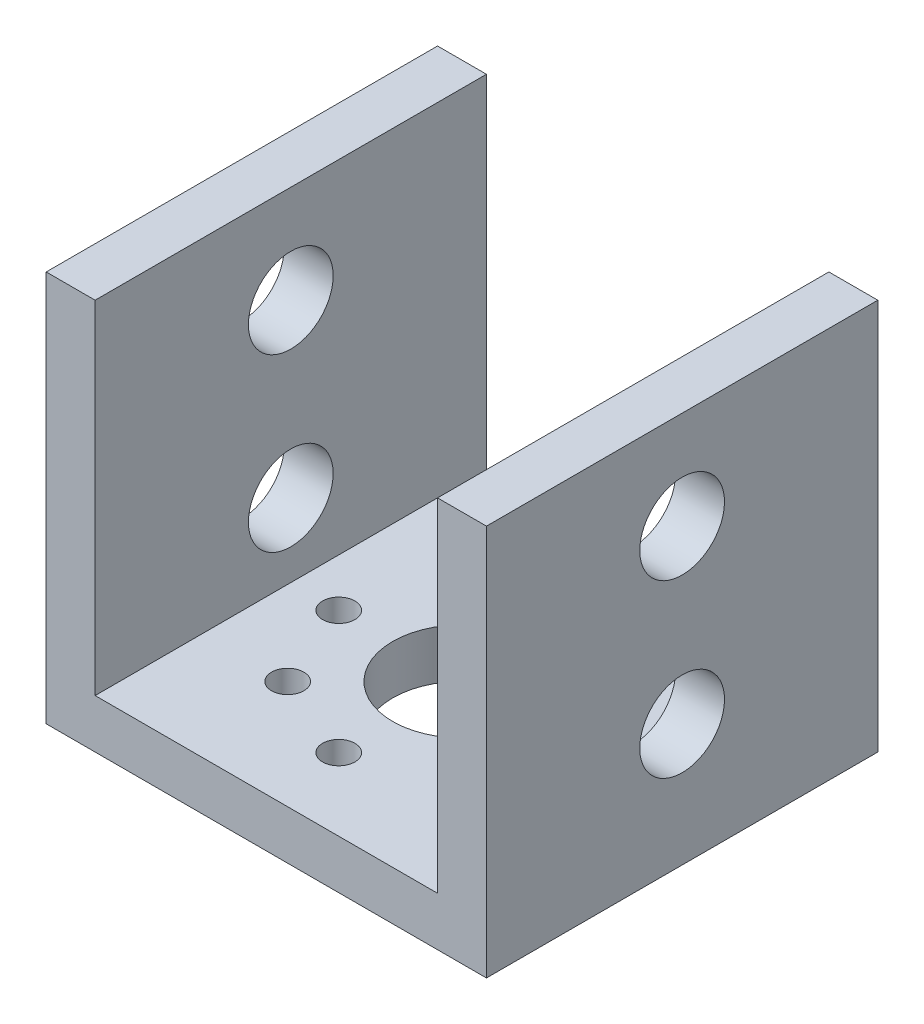
ISO-10303-21;
HEADER;
FILE_DESCRIPTION(('STEP AP214'),'2;1');
FILE_NAME('part.step','',(''),(''),'','','');
FILE_SCHEMA(('AUTOMOTIVE_DESIGN { 1 0 10303 214 1 1 1 1 }'));
ENDSEC;
DATA;
#1=APPLICATION_CONTEXT('core data for automotive mechanical design processes');
#2=APPLICATION_PROTOCOL_DEFINITION('international standard','automotive_design',2000,#1);
#3=PRODUCT_CONTEXT('',#1,'mechanical');
#4=PRODUCT('Part','Part','',(#3));
#5=PRODUCT_RELATED_PRODUCT_CATEGORY('part','',(#4));
#6=PRODUCT_DEFINITION_FORMATION('','',#4);
#7=PRODUCT_DEFINITION_CONTEXT('part definition',#1,'design');
#8=PRODUCT_DEFINITION('design','',#6,#7);
#9=PRODUCT_DEFINITION_SHAPE('','',#8);
#10=(LENGTH_UNIT() NAMED_UNIT(*) SI_UNIT(.MILLI.,.METRE.));
#11=(NAMED_UNIT(*) PLANE_ANGLE_UNIT() SI_UNIT($,.RADIAN.));
#12=(NAMED_UNIT(*) SI_UNIT($,.STERADIAN.) SOLID_ANGLE_UNIT());
#13=UNCERTAINTY_MEASURE_WITH_UNIT(LENGTH_MEASURE(1.E-05),#10,'distance_accuracy_value','');
#14=(GEOMETRIC_REPRESENTATION_CONTEXT(3) GLOBAL_UNCERTAINTY_ASSIGNED_CONTEXT((#13)) GLOBAL_UNIT_ASSIGNED_CONTEXT((#10,
#11,#12)) REPRESENTATION_CONTEXT('',''));
#15=CARTESIAN_POINT('',(0.,0.,0.));
#16=DIRECTION('',(0.,0.,1.));
#17=DIRECTION('',(1.,0.,0.));
#18=AXIS2_PLACEMENT_3D('',#15,#16,#17);
#19=CARTESIAN_POINT('',(-11.1125,0.,25.4));
#20=DIRECTION('',(0.,-1.,0.));
#21=DIRECTION('',(1.,0.,0.));
#22=AXIS2_PLACEMENT_3D('',#19,#20,#21);
#23=PLANE('',#22);
#24=CARTESIAN_POINT('',(0.,0.,4.699999998));
#25=DIRECTION('',(0.,1.,0.));
#26=DIRECTION('',(0.,0.,1.));
#27=AXIS2_PLACEMENT_3D('',#24,#25,#26);
#28=CIRCLE('',#27,1.05);
#29=CARTESIAN_POINT('',(0.,0.,5.749999998));
#30=VERTEX_POINT('',#29);
#31=EDGE_CURVE('E313',#30,#30,#28,.T.);
#32=ORIENTED_EDGE('',*,*,#31,.F.);
#33=EDGE_LOOP('',(#32));
#34=FACE_BOUND('',#33,.T.);
#35=CARTESIAN_POINT('',(5.6568542509066,0.,7.0431457490934));
#36=DIRECTION('',(0.,1.,0.));
#37=DIRECTION('',(0.,0.,1.));
#38=AXIS2_PLACEMENT_3D('',#35,#36,#37);
#39=CIRCLE('',#38,1.05);
#40=CARTESIAN_POINT('',(5.6568542509066,0.,8.0931457490934));
#41=VERTEX_POINT('',#40);
#42=EDGE_CURVE('E305',#41,#41,#39,.T.);
#43=ORIENTED_EDGE('',*,*,#42,.F.);
#44=EDGE_LOOP('',(#43));
#45=FACE_BOUND('',#44,.T.);
#46=CARTESIAN_POINT('',(8.000000002,0.,12.7));
#47=DIRECTION('',(0.,1.,0.));
#48=DIRECTION('',(0.,0.,1.));
#49=AXIS2_PLACEMENT_3D('',#46,#47,#48);
#50=CIRCLE('',#49,1.05);
#51=CARTESIAN_POINT('',(8.000000002,0.,13.75));
#52=VERTEX_POINT('',#51);
#53=EDGE_CURVE('E297',#52,#52,#50,.T.);
#54=ORIENTED_EDGE('',*,*,#53,.F.);
#55=EDGE_LOOP('',(#54));
#56=FACE_BOUND('',#55,.T.);
#57=CARTESIAN_POINT('',(5.6568542509066,0.,18.3568542509066));
#58=DIRECTION('',(0.,1.,0.));
#59=DIRECTION('',(0.,0.,1.));
#60=AXIS2_PLACEMENT_3D('',#57,#58,#59);
#61=CIRCLE('',#60,1.05);
#62=CARTESIAN_POINT('',(5.6568542509066,0.,19.4068542509066));
#63=VERTEX_POINT('',#62);
#64=EDGE_CURVE('E289',#63,#63,#61,.T.);
#65=ORIENTED_EDGE('',*,*,#64,.F.);
#66=EDGE_LOOP('',(#65));
#67=FACE_BOUND('',#66,.T.);
#68=CARTESIAN_POINT('',(0.,0.,20.700000002));
#69=DIRECTION('',(0.,1.,0.));
#70=DIRECTION('',(0.,0.,1.));
#71=AXIS2_PLACEMENT_3D('',#68,#69,#70);
#72=CIRCLE('',#71,1.05);
#73=CARTESIAN_POINT('',(0.,0.,21.750000002));
#74=VERTEX_POINT('',#73);
#75=EDGE_CURVE('E281',#74,#74,#72,.T.);
#76=ORIENTED_EDGE('',*,*,#75,.F.);
#77=EDGE_LOOP('',(#76));
#78=FACE_BOUND('',#77,.T.);
#79=CARTESIAN_POINT('',(-5.65685425090659,0.,7.04314574909341));
#80=DIRECTION('',(0.,1.,0.));
#81=DIRECTION('',(0.,0.,1.));
#82=AXIS2_PLACEMENT_3D('',#79,#80,#81);
#83=CIRCLE('',#82,1.05);
#84=CARTESIAN_POINT('',(-5.65685425090659,0.,8.0931457490934));
#85=VERTEX_POINT('',#84);
#86=EDGE_CURVE('E257',#85,#85,#83,.T.);
#87=ORIENTED_EDGE('',*,*,#86,.F.);
#88=EDGE_LOOP('',(#87));
#89=FACE_BOUND('',#88,.T.);
#90=CARTESIAN_POINT('',(0.,0.,12.7));
#91=DIRECTION('',(0.,1.,0.));
#92=DIRECTION('',(-1.,0.,0.));
#93=AXIS2_PLACEMENT_3D('',#90,#91,#92);
#94=CIRCLE('',#93,4.500000017);
#95=CARTESIAN_POINT('',(-4.500000017,0.,12.7));
#96=VERTEX_POINT('',#95);
#97=EDGE_CURVE('E246',#96,#96,#94,.T.);
#98=ORIENTED_EDGE('',*,*,#97,.F.);
#99=EDGE_LOOP('',(#98));
#100=FACE_BOUND('',#99,.T.);
#101=DIRECTION('',(-1.,0.,0.));
#102=VECTOR('',#101,1.);
#103=CARTESIAN_POINT('',(-11.1125,0.,0.));
#104=LINE('',#103,#102);
#105=CARTESIAN_POINT('',(11.1125,0.,0.));
#106=VERTEX_POINT('',#105);
#107=CARTESIAN_POINT('',(-11.1125,0.,0.));
#108=VERTEX_POINT('',#107);
#109=EDGE_CURVE('E151',#106,#108,#104,.T.);
#110=ORIENTED_EDGE('',*,*,#109,.T.);
#111=DIRECTION('',(0.,0.,-1.));
#112=VECTOR('',#111,1.);
#113=CARTESIAN_POINT('',(-11.1125,0.,25.4));
#114=LINE('',#113,#112);
#115=CARTESIAN_POINT('',(-11.1125,0.,25.4));
#116=VERTEX_POINT('',#115);
#117=EDGE_CURVE('E55',#116,#108,#114,.T.);
#118=ORIENTED_EDGE('',*,*,#117,.F.);
#119=DIRECTION('',(-1.,0.,0.));
#120=VECTOR('',#119,1.);
#121=CARTESIAN_POINT('',(-11.1125,0.,25.4));
#122=LINE('',#121,#120);
#123=CARTESIAN_POINT('',(11.1125,0.,25.4));
#124=VERTEX_POINT('',#123);
#125=EDGE_CURVE('E106',#124,#116,#122,.T.);
#126=ORIENTED_EDGE('',*,*,#125,.F.);
#127=DIRECTION('',(0.,0.,-1.));
#128=VECTOR('',#127,1.);
#129=CARTESIAN_POINT('',(11.1125,0.,25.4));
#130=LINE('',#129,#128);
#131=EDGE_CURVE('E11',#124,#106,#130,.T.);
#132=ORIENTED_EDGE('',*,*,#131,.T.);
#133=EDGE_LOOP('',(#110,#118,#126,#132));
#134=FACE_BOUND('',#133,.T.);
#135=CARTESIAN_POINT('',(-8.000000002,0.,12.7));
#136=DIRECTION('',(0.,1.,0.));
#137=DIRECTION('',(0.,0.,1.));
#138=AXIS2_PLACEMENT_3D('',#135,#136,#137);
#139=CIRCLE('',#138,1.05);
#140=CARTESIAN_POINT('',(-8.000000002,0.,13.75));
#141=VERTEX_POINT('',#140);
#142=EDGE_CURVE('E265',#141,#141,#139,.T.);
#143=ORIENTED_EDGE('',*,*,#142,.F.);
#144=EDGE_LOOP('',(#143));
#145=FACE_BOUND('',#144,.T.);
#146=CARTESIAN_POINT('',(-5.65685425090659,0.,18.3568542509066));
#147=DIRECTION('',(0.,1.,0.));
#148=DIRECTION('',(0.,0.,1.));
#149=AXIS2_PLACEMENT_3D('',#146,#147,#148);
#150=CIRCLE('',#149,1.05);
#151=CARTESIAN_POINT('',(-5.65685425090659,0.,19.4068542509066));
#152=VERTEX_POINT('',#151);
#153=EDGE_CURVE('E273',#152,#152,#150,.T.);
#154=ORIENTED_EDGE('',*,*,#153,.F.);
#155=EDGE_LOOP('',(#154));
#156=FACE_BOUND('',#155,.T.);
#157=ADVANCED_FACE('F45',(#34,#45,#56,#67,#78,#89,#100,#134,#145,#156),#23,.F.);
#158=CARTESIAN_POINT('',(11.1125,0.,25.4));
#159=DIRECTION('',(1.,0.,0.));
#160=DIRECTION('',(0.,1.,0.));
#161=AXIS2_PLACEMENT_3D('',#158,#159,#160);
#162=PLANE('',#161);
#163=CARTESIAN_POINT('',(11.1125,15.875,12.7));
#164=DIRECTION('',(1.,0.,0.));
#165=DIRECTION('',(0.,1.,0.));
#166=AXIS2_PLACEMENT_3D('',#163,#164,#165);
#167=CIRCLE('',#166,2.75);
#168=CARTESIAN_POINT('',(11.1125,18.625,12.7));
#169=VERTEX_POINT('',#168);
#170=EDGE_CURVE('E152',#169,#169,#167,.T.);
#171=ORIENTED_EDGE('',*,*,#170,.T.);
#172=EDGE_LOOP('',(#171));
#173=FACE_BOUND('',#172,.T.);
#174=CARTESIAN_POINT('',(11.1125,4.7625,12.7));
#175=DIRECTION('',(1.,0.,0.));
#176=DIRECTION('',(0.,1.,0.));
#177=AXIS2_PLACEMENT_3D('',#174,#175,#176);
#178=CIRCLE('',#177,2.75);
#179=CARTESIAN_POINT('',(11.1125,7.5125,12.7));
#180=VERTEX_POINT('',#179);
#181=EDGE_CURVE('E221',#180,#180,#178,.T.);
#182=ORIENTED_EDGE('',*,*,#181,.T.);
#183=EDGE_LOOP('',(#182));
#184=FACE_BOUND('',#183,.T.);
#185=DIRECTION('',(0.,-1.,0.));
#186=VECTOR('',#185,1.);
#187=CARTESIAN_POINT('',(11.1125,0.,0.));
#188=LINE('',#187,#186);
#189=CARTESIAN_POINT('',(11.1125,22.225,0.));
#190=VERTEX_POINT('',#189);
#191=EDGE_CURVE('E147',#190,#106,#188,.T.);
#192=ORIENTED_EDGE('',*,*,#191,.T.);
#193=ORIENTED_EDGE('',*,*,#131,.F.);
#194=DIRECTION('',(0.,-1.,0.));
#195=VECTOR('',#194,1.);
#196=CARTESIAN_POINT('',(11.1125,0.,25.4));
#197=LINE('',#196,#195);
#198=CARTESIAN_POINT('',(11.1125,22.225,25.4));
#199=VERTEX_POINT('',#198);
#200=EDGE_CURVE('E170',#199,#124,#197,.T.);
#201=ORIENTED_EDGE('',*,*,#200,.F.);
#202=DIRECTION('',(0.,0.,-1.));
#203=VECTOR('',#202,1.);
#204=CARTESIAN_POINT('',(11.1125,22.225,25.4));
#205=LINE('',#204,#203);
#206=EDGE_CURVE('E143',#199,#190,#205,.T.);
#207=ORIENTED_EDGE('',*,*,#206,.T.);
#208=EDGE_LOOP('',(#192,#193,#201,#207));
#209=FACE_BOUND('',#208,.T.);
#210=ADVANCED_FACE('F47',(#173,#184,#209),#162,.F.);
#211=CARTESIAN_POINT('',(-11.1125,0.,25.4));
#212=DIRECTION('',(-1.,0.,0.));
#213=DIRECTION('',(0.,-1.,0.));
#214=AXIS2_PLACEMENT_3D('',#211,#212,#213);
#215=PLANE('',#214);
#216=CARTESIAN_POINT('',(-11.1125,15.875,12.7));
#217=DIRECTION('',(-1.,0.,0.));
#218=DIRECTION('',(0.,-1.,0.));
#219=AXIS2_PLACEMENT_3D('',#216,#217,#218);
#220=CIRCLE('',#219,2.75);
#221=CARTESIAN_POINT('',(-11.1125,13.125,12.7));
#222=VERTEX_POINT('',#221);
#223=EDGE_CURVE('E217',#222,#222,#220,.T.);
#224=ORIENTED_EDGE('',*,*,#223,.T.);
#225=EDGE_LOOP('',(#224));
#226=FACE_BOUND('',#225,.T.);
#227=CARTESIAN_POINT('',(-11.1125,4.7625,12.7));
#228=DIRECTION('',(-1.,0.,0.));
#229=DIRECTION('',(0.,-1.,0.));
#230=AXIS2_PLACEMENT_3D('',#227,#228,#229);
#231=CIRCLE('',#230,2.75);
#232=CARTESIAN_POINT('',(-11.1125,2.0125,12.7));
#233=VERTEX_POINT('',#232);
#234=EDGE_CURVE('E225',#233,#233,#231,.T.);
#235=ORIENTED_EDGE('',*,*,#234,.T.);
#236=EDGE_LOOP('',(#235));
#237=FACE_BOUND('',#236,.T.);
#238=DIRECTION('',(0.,1.,0.));
#239=VECTOR('',#238,1.);
#240=CARTESIAN_POINT('',(-11.1125,0.,0.));
#241=LINE('',#240,#239);
#242=CARTESIAN_POINT('',(-11.1125,22.225,0.));
#243=VERTEX_POINT('',#242);
#244=EDGE_CURVE('E155',#108,#243,#241,.T.);
#245=ORIENTED_EDGE('',*,*,#244,.T.);
#246=DIRECTION('',(0.,0.,-1.));
#247=VECTOR('',#246,1.);
#248=CARTESIAN_POINT('',(-11.1125,22.225,25.4));
#249=LINE('',#248,#247);
#250=CARTESIAN_POINT('',(-11.1125,22.225,25.4));
#251=VERTEX_POINT('',#250);
#252=EDGE_CURVE('E181',#251,#243,#249,.T.);
#253=ORIENTED_EDGE('',*,*,#252,.F.);
#254=DIRECTION('',(0.,1.,0.));
#255=VECTOR('',#254,1.);
#256=CARTESIAN_POINT('',(-11.1125,0.,25.4));
#257=LINE('',#256,#255);
#258=EDGE_CURVE('E191',#116,#251,#257,.T.);
#259=ORIENTED_EDGE('',*,*,#258,.F.);
#260=ORIENTED_EDGE('',*,*,#117,.T.);
#261=EDGE_LOOP('',(#245,#253,#259,#260));
#262=FACE_BOUND('',#261,.T.);
#263=ADVANCED_FACE('F189',(#226,#237,#262),#215,.F.);
#264=CARTESIAN_POINT('',(-11.1125,22.225,25.4));
#265=DIRECTION('',(0.,-1.,0.));
#266=DIRECTION('',(0.,0.,-1.));
#267=AXIS2_PLACEMENT_3D('',#264,#265,#266);
#268=PLANE('',#267);
#269=DIRECTION('',(-1.,0.,0.));
#270=VECTOR('',#269,1.);
#271=CARTESIAN_POINT('',(-11.1125,22.225,0.));
#272=LINE('',#271,#270);
#273=CARTESIAN_POINT('',(-14.2875,22.225,0.));
#274=VERTEX_POINT('',#273);
#275=EDGE_CURVE('E158',#243,#274,#272,.T.);
#276=ORIENTED_EDGE('',*,*,#275,.T.);
#277=DIRECTION('',(0.,0.,-1.));
#278=VECTOR('',#277,1.);
#279=CARTESIAN_POINT('',(-14.2875,22.225,25.4));
#280=LINE('',#279,#278);
#281=CARTESIAN_POINT('',(-14.2875,22.225,25.4));
#282=VERTEX_POINT('',#281);
#283=EDGE_CURVE('E177',#282,#274,#280,.T.);
#284=ORIENTED_EDGE('',*,*,#283,.F.);
#285=DIRECTION('',(-1.,0.,0.));
#286=VECTOR('',#285,1.);
#287=CARTESIAN_POINT('',(-11.1125,22.225,25.4));
#288=LINE('',#287,#286);
#289=EDGE_CURVE('E204',#251,#282,#288,.T.);
#290=ORIENTED_EDGE('',*,*,#289,.F.);
#291=ORIENTED_EDGE('',*,*,#252,.T.);
#292=EDGE_LOOP('',(#276,#284,#290,#291));
#293=FACE_BOUND('',#292,.T.);
#294=ADVANCED_FACE('F199',(#293),#268,.F.);
#295=CARTESIAN_POINT('',(-14.2875,-3.175,25.4));
#296=DIRECTION('',(1.,0.,0.));
#297=DIRECTION('',(0.,0.,-1.));
#298=AXIS2_PLACEMENT_3D('',#295,#296,#297);
#299=PLANE('',#298);
#300=CARTESIAN_POINT('',(-14.2875,15.875,12.7));
#301=DIRECTION('',(1.,0.,0.));
#302=DIRECTION('',(0.,1.,0.));
#303=AXIS2_PLACEMENT_3D('',#300,#301,#302);
#304=CIRCLE('',#303,2.75);
#305=CARTESIAN_POINT('',(-14.2875,18.625,12.7));
#306=VERTEX_POINT('',#305);
#307=EDGE_CURVE('E229',#306,#306,#304,.T.);
#308=ORIENTED_EDGE('',*,*,#307,.T.);
#309=EDGE_LOOP('',(#308));
#310=FACE_BOUND('',#309,.T.);
#311=CARTESIAN_POINT('',(-14.2875,4.76249999999999,12.7));
#312=DIRECTION('',(1.,0.,0.));
#313=DIRECTION('',(0.,1.,0.));
#314=AXIS2_PLACEMENT_3D('',#311,#312,#313);
#315=CIRCLE('',#314,2.75);
#316=CARTESIAN_POINT('',(-14.2875,7.51249999999999,12.7));
#317=VERTEX_POINT('',#316);
#318=EDGE_CURVE('E230',#317,#317,#315,.T.);
#319=ORIENTED_EDGE('',*,*,#318,.T.);
#320=EDGE_LOOP('',(#319));
#321=FACE_BOUND('',#320,.T.);
#322=DIRECTION('',(0.,-1.,0.));
#323=VECTOR('',#322,1.);
#324=CARTESIAN_POINT('',(-14.2875,-3.175,0.));
#325=LINE('',#324,#323);
#326=CARTESIAN_POINT('',(-14.2875,-3.175,0.));
#327=VERTEX_POINT('',#326);
#328=EDGE_CURVE('E161',#274,#327,#325,.T.);
#329=ORIENTED_EDGE('',*,*,#328,.T.);
#330=DIRECTION('',(0.,0.,-1.));
#331=VECTOR('',#330,1.);
#332=CARTESIAN_POINT('',(-14.2875,-3.175,25.4));
#333=LINE('',#332,#331);
#334=CARTESIAN_POINT('',(-14.2875,-3.175,25.4));
#335=VERTEX_POINT('',#334);
#336=EDGE_CURVE('E136',#335,#327,#333,.T.);
#337=ORIENTED_EDGE('',*,*,#336,.F.);
#338=DIRECTION('',(0.,-1.,0.));
#339=VECTOR('',#338,1.);
#340=CARTESIAN_POINT('',(-14.2875,-3.175,25.4));
#341=LINE('',#340,#339);
#342=EDGE_CURVE('E125',#282,#335,#341,.T.);
#343=ORIENTED_EDGE('',*,*,#342,.F.);
#344=ORIENTED_EDGE('',*,*,#283,.T.);
#345=EDGE_LOOP('',(#329,#337,#343,#344));
#346=FACE_BOUND('',#345,.T.);
#347=ADVANCED_FACE('F202',(#310,#321,#346),#299,.F.);
#348=CARTESIAN_POINT('',(-14.2875,-3.175,25.4));
#349=DIRECTION('',(0.,1.,0.));
#350=DIRECTION('',(-1.,0.,0.));
#351=AXIS2_PLACEMENT_3D('',#348,#349,#350);
#352=PLANE('',#351);
#353=CARTESIAN_POINT('',(0.,-3.17500000000001,4.699999998));
#354=DIRECTION('',(0.,1.,0.));
#355=DIRECTION('',(0.,0.,1.));
#356=AXIS2_PLACEMENT_3D('',#353,#354,#355);
#357=CIRCLE('',#356,1.05);
#358=CARTESIAN_POINT('',(0.,-3.17500000000001,5.749999998));
#359=VERTEX_POINT('',#358);
#360=EDGE_CURVE('E309',#359,#359,#357,.T.);
#361=ORIENTED_EDGE('',*,*,#360,.T.);
#362=EDGE_LOOP('',(#361));
#363=FACE_BOUND('',#362,.T.);
#364=CARTESIAN_POINT('',(5.6568542509066,-3.175,7.0431457490934));
#365=DIRECTION('',(0.,1.,0.));
#366=DIRECTION('',(0.,0.,1.));
#367=AXIS2_PLACEMENT_3D('',#364,#365,#366);
#368=CIRCLE('',#367,1.05);
#369=CARTESIAN_POINT('',(5.6568542509066,-3.175,8.0931457490934));
#370=VERTEX_POINT('',#369);
#371=EDGE_CURVE('E301',#370,#370,#368,.T.);
#372=ORIENTED_EDGE('',*,*,#371,.T.);
#373=EDGE_LOOP('',(#372));
#374=FACE_BOUND('',#373,.T.);
#375=CARTESIAN_POINT('',(8.000000002,-3.175,12.7));
#376=DIRECTION('',(0.,1.,0.));
#377=DIRECTION('',(0.,0.,1.));
#378=AXIS2_PLACEMENT_3D('',#375,#376,#377);
#379=CIRCLE('',#378,1.05);
#380=CARTESIAN_POINT('',(8.000000002,-3.175,13.75));
#381=VERTEX_POINT('',#380);
#382=EDGE_CURVE('E293',#381,#381,#379,.T.);
#383=ORIENTED_EDGE('',*,*,#382,.T.);
#384=EDGE_LOOP('',(#383));
#385=FACE_BOUND('',#384,.T.);
#386=CARTESIAN_POINT('',(5.6568542509066,-3.175,18.3568542509066));
#387=DIRECTION('',(0.,1.,0.));
#388=DIRECTION('',(0.,0.,1.));
#389=AXIS2_PLACEMENT_3D('',#386,#387,#388);
#390=CIRCLE('',#389,1.05);
#391=CARTESIAN_POINT('',(5.6568542509066,-3.175,19.4068542509066));
#392=VERTEX_POINT('',#391);
#393=EDGE_CURVE('E285',#392,#392,#390,.T.);
#394=ORIENTED_EDGE('',*,*,#393,.T.);
#395=EDGE_LOOP('',(#394));
#396=FACE_BOUND('',#395,.T.);
#397=CARTESIAN_POINT('',(0.,-3.17500000000001,20.700000002));
#398=DIRECTION('',(0.,1.,0.));
#399=DIRECTION('',(0.,0.,1.));
#400=AXIS2_PLACEMENT_3D('',#397,#398,#399);
#401=CIRCLE('',#400,1.05);
#402=CARTESIAN_POINT('',(0.,-3.17500000000001,21.750000002));
#403=VERTEX_POINT('',#402);
#404=EDGE_CURVE('E277',#403,#403,#401,.T.);
#405=ORIENTED_EDGE('',*,*,#404,.T.);
#406=EDGE_LOOP('',(#405));
#407=FACE_BOUND('',#406,.T.);
#408=CARTESIAN_POINT('',(-5.65685425090659,-3.17500000000001,18.3568542509066));
#409=DIRECTION('',(0.,1.,0.));
#410=DIRECTION('',(0.,0.,1.));
#411=AXIS2_PLACEMENT_3D('',#408,#409,#410);
#412=CIRCLE('',#411,1.05);
#413=CARTESIAN_POINT('',(-5.65685425090659,-3.17500000000001,19.4068542509066));
#414=VERTEX_POINT('',#413);
#415=EDGE_CURVE('E269',#414,#414,#412,.T.);
#416=ORIENTED_EDGE('',*,*,#415,.T.);
#417=EDGE_LOOP('',(#416));
#418=FACE_BOUND('',#417,.T.);
#419=CARTESIAN_POINT('',(-8.000000002,-3.17500000000001,12.7));
#420=DIRECTION('',(0.,1.,0.));
#421=DIRECTION('',(0.,0.,1.));
#422=AXIS2_PLACEMENT_3D('',#419,#420,#421);
#423=CIRCLE('',#422,1.05);
#424=CARTESIAN_POINT('',(-8.000000002,-3.17500000000001,13.75));
#425=VERTEX_POINT('',#424);
#426=EDGE_CURVE('E261',#425,#425,#423,.T.);
#427=ORIENTED_EDGE('',*,*,#426,.T.);
#428=EDGE_LOOP('',(#427));
#429=FACE_BOUND('',#428,.T.);
#430=CARTESIAN_POINT('',(-5.65685425090659,-3.17500000000001,7.04314574909341));
#431=DIRECTION('',(0.,1.,0.));
#432=DIRECTION('',(0.,0.,1.));
#433=AXIS2_PLACEMENT_3D('',#430,#431,#432);
#434=CIRCLE('',#433,1.05);
#435=CARTESIAN_POINT('',(-5.65685425090659,-3.17500000000001,8.0931457490934));
#436=VERTEX_POINT('',#435);
#437=EDGE_CURVE('E250',#436,#436,#434,.T.);
#438=ORIENTED_EDGE('',*,*,#437,.T.);
#439=EDGE_LOOP('',(#438));
#440=FACE_BOUND('',#439,.T.);
#441=CARTESIAN_POINT('',(0.,-3.175,12.7));
#442=DIRECTION('',(0.,1.,0.));
#443=DIRECTION('',(-1.,0.,0.));
#444=AXIS2_PLACEMENT_3D('',#441,#442,#443);
#445=CIRCLE('',#444,4.500000017);
#446=CARTESIAN_POINT('',(-4.500000017,-3.175,12.7));
#447=VERTEX_POINT('',#446);
#448=EDGE_CURVE('E235',#447,#447,#445,.T.);
#449=ORIENTED_EDGE('',*,*,#448,.T.);
#450=EDGE_LOOP('',(#449));
#451=FACE_BOUND('',#450,.T.);
#452=DIRECTION('',(1.,0.,0.));
#453=VECTOR('',#452,1.);
#454=CARTESIAN_POINT('',(-14.2875,-3.175,0.));
#455=LINE('',#454,#453);
#456=CARTESIAN_POINT('',(14.2875,-3.17499999999999,0.));
#457=VERTEX_POINT('',#456);
#458=EDGE_CURVE('E134',#327,#457,#455,.T.);
#459=ORIENTED_EDGE('',*,*,#458,.T.);
#460=DIRECTION('',(0.,0.,-1.));
#461=VECTOR('',#460,1.);
#462=CARTESIAN_POINT('',(14.2875,-3.17499999999999,25.4));
#463=LINE('',#462,#461);
#464=CARTESIAN_POINT('',(14.2875,-3.17499999999999,25.4));
#465=VERTEX_POINT('',#464);
#466=EDGE_CURVE('E131',#465,#457,#463,.T.);
#467=ORIENTED_EDGE('',*,*,#466,.F.);
#468=DIRECTION('',(1.,0.,0.));
#469=VECTOR('',#468,1.);
#470=CARTESIAN_POINT('',(-14.2875,-3.175,25.4));
#471=LINE('',#470,#469);
#472=EDGE_CURVE('E119',#335,#465,#471,.T.);
#473=ORIENTED_EDGE('',*,*,#472,.F.);
#474=ORIENTED_EDGE('',*,*,#336,.T.);
#475=EDGE_LOOP('',(#459,#467,#473,#474));
#476=FACE_BOUND('',#475,.T.);
#477=ADVANCED_FACE('F132',(#363,#374,#385,#396,#407,#418,#429,#440,#451,#476),#352,.F.);
#478=CARTESIAN_POINT('',(14.2875,-3.17499999999999,25.4));
#479=DIRECTION('',(-1.,0.,0.));
#480=DIRECTION('',(0.,-1.,0.));
#481=AXIS2_PLACEMENT_3D('',#478,#479,#480);
#482=PLANE('',#481);
#483=CARTESIAN_POINT('',(14.2875,15.875,12.7));
#484=DIRECTION('',(1.,0.,0.));
#485=DIRECTION('',(0.,1.,0.));
#486=AXIS2_PLACEMENT_3D('',#483,#484,#485);
#487=CIRCLE('',#486,2.75);
#488=CARTESIAN_POINT('',(14.2875,18.625,12.7));
#489=VERTEX_POINT('',#488);
#490=EDGE_CURVE('E239',#489,#489,#487,.T.);
#491=ORIENTED_EDGE('',*,*,#490,.F.);
#492=EDGE_LOOP('',(#491));
#493=FACE_BOUND('',#492,.T.);
#494=CARTESIAN_POINT('',(14.2875,4.76250000000001,12.7));
#495=DIRECTION('',(1.,0.,0.));
#496=DIRECTION('',(0.,1.,0.));
#497=AXIS2_PLACEMENT_3D('',#494,#495,#496);
#498=CIRCLE('',#497,2.75);
#499=CARTESIAN_POINT('',(14.2875,7.5125,12.7));
#500=VERTEX_POINT('',#499);
#501=EDGE_CURVE('E234',#500,#500,#498,.T.);
#502=ORIENTED_EDGE('',*,*,#501,.F.);
#503=EDGE_LOOP('',(#502));
#504=FACE_BOUND('',#503,.T.);
#505=DIRECTION('',(0.,1.,0.));
#506=VECTOR('',#505,1.);
#507=CARTESIAN_POINT('',(14.2875,-3.17499999999999,0.));
#508=LINE('',#507,#506);
#509=CARTESIAN_POINT('',(14.2875,22.225,0.));
#510=VERTEX_POINT('',#509);
#511=EDGE_CURVE('E92',#457,#510,#508,.T.);
#512=ORIENTED_EDGE('',*,*,#511,.T.);
#513=DIRECTION('',(0.,0.,-1.));
#514=VECTOR('',#513,1.);
#515=CARTESIAN_POINT('',(14.2875,22.225,25.4));
#516=LINE('',#515,#514);
#517=CARTESIAN_POINT('',(14.2875,22.225,25.4));
#518=VERTEX_POINT('',#517);
#519=EDGE_CURVE('E137',#518,#510,#516,.T.);
#520=ORIENTED_EDGE('',*,*,#519,.F.);
#521=DIRECTION('',(0.,1.,0.));
#522=VECTOR('',#521,1.);
#523=CARTESIAN_POINT('',(14.2875,-3.17499999999999,25.4));
#524=LINE('',#523,#522);
#525=EDGE_CURVE('E123',#465,#518,#524,.T.);
#526=ORIENTED_EDGE('',*,*,#525,.F.);
#527=ORIENTED_EDGE('',*,*,#466,.T.);
#528=EDGE_LOOP('',(#512,#520,#526,#527));
#529=FACE_BOUND('',#528,.T.);
#530=ADVANCED_FACE('F139',(#493,#504,#529),#482,.F.);
#531=CARTESIAN_POINT('',(11.1125,22.225,25.4));
#532=DIRECTION('',(0.,-1.,0.));
#533=DIRECTION('',(1.,0.,0.));
#534=AXIS2_PLACEMENT_3D('',#531,#532,#533);
#535=PLANE('',#534);
#536=DIRECTION('',(-1.,0.,0.));
#537=VECTOR('',#536,1.);
#538=CARTESIAN_POINT('',(11.1125,22.225,0.));
#539=LINE('',#538,#537);
#540=EDGE_CURVE('E98',#510,#190,#539,.T.);
#541=ORIENTED_EDGE('',*,*,#540,.T.);
#542=ORIENTED_EDGE('',*,*,#206,.F.);
#543=DIRECTION('',(-1.,0.,0.));
#544=VECTOR('',#543,1.);
#545=CARTESIAN_POINT('',(11.1125,22.225,25.4));
#546=LINE('',#545,#544);
#547=EDGE_CURVE('E63',#518,#199,#546,.T.);
#548=ORIENTED_EDGE('',*,*,#547,.F.);
#549=ORIENTED_EDGE('',*,*,#519,.T.);
#550=EDGE_LOOP('',(#541,#542,#548,#549));
#551=FACE_BOUND('',#550,.T.);
#552=ADVANCED_FACE('F376',(#551),#535,.F.);
#553=CARTESIAN_POINT('',(0.,0.,25.4));
#554=DIRECTION('',(0.,0.,-1.));
#555=DIRECTION('',(-1.,0.,0.));
#556=AXIS2_PLACEMENT_3D('',#553,#554,#555);
#557=PLANE('',#556);
#558=ORIENTED_EDGE('',*,*,#200,.T.);
#559=ORIENTED_EDGE('',*,*,#125,.T.);
#560=ORIENTED_EDGE('',*,*,#258,.T.);
#561=ORIENTED_EDGE('',*,*,#289,.T.);
#562=ORIENTED_EDGE('',*,*,#342,.T.);
#563=ORIENTED_EDGE('',*,*,#472,.T.);
#564=ORIENTED_EDGE('',*,*,#525,.T.);
#565=ORIENTED_EDGE('',*,*,#547,.T.);
#566=EDGE_LOOP('',(#558,#559,#560,#561,#562,#563,#564,#565));
#567=FACE_BOUND('',#566,.T.);
#568=ADVANCED_FACE('F121',(#567),#557,.F.);
#569=CARTESIAN_POINT('',(0.,0.,0.));
#570=DIRECTION('',(0.,0.,-1.));
#571=DIRECTION('',(-1.,0.,0.));
#572=AXIS2_PLACEMENT_3D('',#569,#570,#571);
#573=PLANE('',#572);
#574=ORIENTED_EDGE('',*,*,#191,.F.);
#575=ORIENTED_EDGE('',*,*,#540,.F.);
#576=ORIENTED_EDGE('',*,*,#511,.F.);
#577=ORIENTED_EDGE('',*,*,#458,.F.);
#578=ORIENTED_EDGE('',*,*,#328,.F.);
#579=ORIENTED_EDGE('',*,*,#275,.F.);
#580=ORIENTED_EDGE('',*,*,#244,.F.);
#581=ORIENTED_EDGE('',*,*,#109,.F.);
#582=EDGE_LOOP('',(#574,#575,#576,#577,#578,#579,#580,#581));
#583=FACE_BOUND('',#582,.T.);
#584=ADVANCED_FACE('F195',(#583),#573,.T.);
#585=CARTESIAN_POINT('',(-14.2875,4.76249999999999,12.7));
#586=DIRECTION('',(1.,0.,0.));
#587=DIRECTION('',(0.,1.,0.));
#588=AXIS2_PLACEMENT_3D('',#585,#586,#587);
#589=CYLINDRICAL_SURFACE('',#588,2.75);
#590=ORIENTED_EDGE('',*,*,#501,.T.);
#591=EDGE_LOOP('',(#590));
#592=FACE_BOUND('',#591,.T.);
#593=ORIENTED_EDGE('',*,*,#181,.F.);
#594=EDGE_LOOP('',(#593));
#595=FACE_BOUND('',#594,.T.);
#596=ADVANCED_FACE('F369',(#592,#595),#589,.F.);
#597=CARTESIAN_POINT('',(-14.2875,15.875,12.7));
#598=DIRECTION('',(1.,0.,0.));
#599=DIRECTION('',(0.,1.,0.));
#600=AXIS2_PLACEMENT_3D('',#597,#598,#599);
#601=CYLINDRICAL_SURFACE('',#600,2.75);
#602=ORIENTED_EDGE('',*,*,#490,.T.);
#603=EDGE_LOOP('',(#602));
#604=FACE_BOUND('',#603,.T.);
#605=ORIENTED_EDGE('',*,*,#170,.F.);
#606=EDGE_LOOP('',(#605));
#607=FACE_BOUND('',#606,.T.);
#608=ADVANCED_FACE('F365',(#604,#607),#601,.F.);
#609=ORIENTED_EDGE('',*,*,#318,.F.);
#610=EDGE_LOOP('',(#609));
#611=FACE_BOUND('',#610,.T.);
#612=ORIENTED_EDGE('',*,*,#234,.F.);
#613=EDGE_LOOP('',(#612));
#614=FACE_BOUND('',#613,.T.);
#615=ADVANCED_FACE('F368',(#611,#614),#589,.F.);
#616=ORIENTED_EDGE('',*,*,#307,.F.);
#617=EDGE_LOOP('',(#616));
#618=FACE_BOUND('',#617,.T.);
#619=ORIENTED_EDGE('',*,*,#223,.F.);
#620=EDGE_LOOP('',(#619));
#621=FACE_BOUND('',#620,.T.);
#622=ADVANCED_FACE('F363',(#618,#621),#601,.F.);
#623=CARTESIAN_POINT('',(0.,-3.175,12.7));
#624=DIRECTION('',(0.,1.,0.));
#625=DIRECTION('',(-1.,0.,0.));
#626=AXIS2_PLACEMENT_3D('',#623,#624,#625);
#627=CYLINDRICAL_SURFACE('',#626,4.500000017);
#628=ORIENTED_EDGE('',*,*,#448,.F.);
#629=EDGE_LOOP('',(#628));
#630=FACE_BOUND('',#629,.T.);
#631=ORIENTED_EDGE('',*,*,#97,.T.);
#632=EDGE_LOOP('',(#631));
#633=FACE_BOUND('',#632,.T.);
#634=ADVANCED_FACE('F359',(#630,#633),#627,.F.);
#635=CARTESIAN_POINT('',(-5.65685425090659,0.,7.04314574909341));
#636=DIRECTION('',(0.,1.,0.));
#637=DIRECTION('',(0.,0.,1.));
#638=AXIS2_PLACEMENT_3D('',#635,#636,#637);
#639=CYLINDRICAL_SURFACE('',#638,1.05);
#640=ORIENTED_EDGE('',*,*,#437,.F.);
#641=EDGE_LOOP('',(#640));
#642=FACE_BOUND('',#641,.T.);
#643=ORIENTED_EDGE('',*,*,#86,.T.);
#644=EDGE_LOOP('',(#643));
#645=FACE_BOUND('',#644,.T.);
#646=ADVANCED_FACE('F351',(#642,#645),#639,.F.);
#647=CARTESIAN_POINT('',(-8.000000002,0.,12.7));
#648=DIRECTION('',(0.,1.,0.));
#649=DIRECTION('',(0.,0.,1.));
#650=AXIS2_PLACEMENT_3D('',#647,#648,#649);
#651=CYLINDRICAL_SURFACE('',#650,1.05);
#652=ORIENTED_EDGE('',*,*,#426,.F.);
#653=EDGE_LOOP('',(#652));
#654=FACE_BOUND('',#653,.T.);
#655=ORIENTED_EDGE('',*,*,#142,.T.);
#656=EDGE_LOOP('',(#655));
#657=FACE_BOUND('',#656,.T.);
#658=ADVANCED_FACE('F341',(#654,#657),#651,.F.);
#659=CARTESIAN_POINT('',(-5.65685425090659,0.,18.3568542509066));
#660=DIRECTION('',(0.,1.,0.));
#661=DIRECTION('',(0.,0.,1.));
#662=AXIS2_PLACEMENT_3D('',#659,#660,#661);
#663=CYLINDRICAL_SURFACE('',#662,1.05);
#664=ORIENTED_EDGE('',*,*,#415,.F.);
#665=EDGE_LOOP('',(#664));
#666=FACE_BOUND('',#665,.T.);
#667=ORIENTED_EDGE('',*,*,#153,.T.);
#668=EDGE_LOOP('',(#667));
#669=FACE_BOUND('',#668,.T.);
#670=ADVANCED_FACE('F338',(#666,#669),#663,.F.);
#671=CARTESIAN_POINT('',(0.,0.,20.700000002));
#672=DIRECTION('',(0.,1.,0.));
#673=DIRECTION('',(0.,0.,1.));
#674=AXIS2_PLACEMENT_3D('',#671,#672,#673);
#675=CYLINDRICAL_SURFACE('',#674,1.05);
#676=ORIENTED_EDGE('',*,*,#404,.F.);
#677=EDGE_LOOP('',(#676));
#678=FACE_BOUND('',#677,.T.);
#679=ORIENTED_EDGE('',*,*,#75,.T.);
#680=EDGE_LOOP('',(#679));
#681=FACE_BOUND('',#680,.T.);
#682=ADVANCED_FACE('F340',(#678,#681),#675,.F.);
#683=CARTESIAN_POINT('',(5.6568542509066,0.,18.3568542509066));
#684=DIRECTION('',(0.,1.,0.));
#685=DIRECTION('',(0.,0.,1.));
#686=AXIS2_PLACEMENT_3D('',#683,#684,#685);
#687=CYLINDRICAL_SURFACE('',#686,1.05);
#688=ORIENTED_EDGE('',*,*,#393,.F.);
#689=EDGE_LOOP('',(#688));
#690=FACE_BOUND('',#689,.T.);
#691=ORIENTED_EDGE('',*,*,#64,.T.);
#692=EDGE_LOOP('',(#691));
#693=FACE_BOUND('',#692,.T.);
#694=ADVANCED_FACE('F348',(#690,#693),#687,.F.);
#695=CARTESIAN_POINT('',(8.000000002,0.,12.7));
#696=DIRECTION('',(0.,1.,0.));
#697=DIRECTION('',(0.,0.,1.));
#698=AXIS2_PLACEMENT_3D('',#695,#696,#697);
#699=CYLINDRICAL_SURFACE('',#698,1.05);
#700=ORIENTED_EDGE('',*,*,#382,.F.);
#701=EDGE_LOOP('',(#700));
#702=FACE_BOUND('',#701,.T.);
#703=ORIENTED_EDGE('',*,*,#53,.T.);
#704=EDGE_LOOP('',(#703));
#705=FACE_BOUND('',#704,.T.);
#706=ADVANCED_FACE('F446',(#702,#705),#699,.F.);
#707=CARTESIAN_POINT('',(5.6568542509066,0.,7.0431457490934));
#708=DIRECTION('',(0.,1.,0.));
#709=DIRECTION('',(0.,0.,1.));
#710=AXIS2_PLACEMENT_3D('',#707,#708,#709);
#711=CYLINDRICAL_SURFACE('',#710,1.05);
#712=ORIENTED_EDGE('',*,*,#371,.F.);
#713=EDGE_LOOP('',(#712));
#714=FACE_BOUND('',#713,.T.);
#715=ORIENTED_EDGE('',*,*,#42,.T.);
#716=EDGE_LOOP('',(#715));
#717=FACE_BOUND('',#716,.T.);
#718=ADVANCED_FACE('F455',(#714,#717),#711,.F.);
#719=CARTESIAN_POINT('',(0.,0.,4.699999998));
#720=DIRECTION('',(0.,1.,0.));
#721=DIRECTION('',(0.,0.,1.));
#722=AXIS2_PLACEMENT_3D('',#719,#720,#721);
#723=CYLINDRICAL_SURFACE('',#722,1.05);
#724=ORIENTED_EDGE('',*,*,#360,.F.);
#725=EDGE_LOOP('',(#724));
#726=FACE_BOUND('',#725,.T.);
#727=ORIENTED_EDGE('',*,*,#31,.T.);
#728=EDGE_LOOP('',(#727));
#729=FACE_BOUND('',#728,.T.);
#730=ADVANCED_FACE('F318',(#726,#729),#723,.F.);
#731=CLOSED_SHELL('',(#157,#210,#263,#294,#347,#477,#530,#552,#568,#584,#596,#608,#615,#622,
#634,#646,#658,#670,#682,#694,#706,#718,#730));
#732=MANIFOLD_SOLID_BREP('B2',#731);
#733=ADVANCED_BREP_SHAPE_REPRESENTATION('',(#18,#732),#14);
#734=SHAPE_DEFINITION_REPRESENTATION(#9,#733);
ENDSEC;
END-ISO-10303-21;
